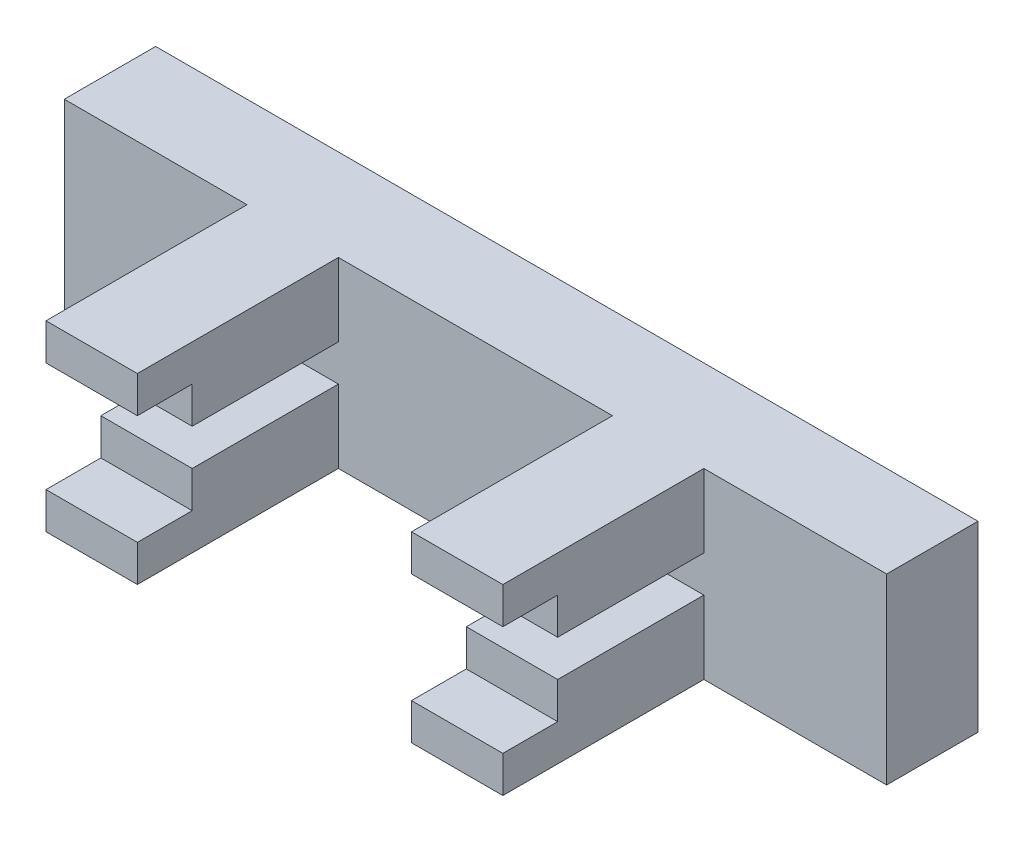
ISO-10303-21;
HEADER;
FILE_DESCRIPTION(('STEP AP214'),'2;1');
FILE_NAME('part.step','',(''),(''),'','','');
FILE_SCHEMA(('AUTOMOTIVE_DESIGN { 1 0 10303 214 1 1 1 1 }'));
ENDSEC;
DATA;
#1=APPLICATION_CONTEXT('core data for automotive mechanical design processes');
#2=APPLICATION_PROTOCOL_DEFINITION('international standard','automotive_design',2000,#1);
#3=PRODUCT_CONTEXT('',#1,'mechanical');
#4=PRODUCT('Part','Part','',(#3));
#5=PRODUCT_RELATED_PRODUCT_CATEGORY('part','',(#4));
#6=PRODUCT_DEFINITION_FORMATION('','',#4);
#7=PRODUCT_DEFINITION_CONTEXT('part definition',#1,'design');
#8=PRODUCT_DEFINITION('design','',#6,#7);
#9=PRODUCT_DEFINITION_SHAPE('','',#8);
#10=(LENGTH_UNIT() NAMED_UNIT(*) SI_UNIT(.MILLI.,.METRE.));
#11=(NAMED_UNIT(*) PLANE_ANGLE_UNIT() SI_UNIT($,.RADIAN.));
#12=(NAMED_UNIT(*) SI_UNIT($,.STERADIAN.) SOLID_ANGLE_UNIT());
#13=UNCERTAINTY_MEASURE_WITH_UNIT(LENGTH_MEASURE(1.E-05),#10,'distance_accuracy_value','');
#14=(GEOMETRIC_REPRESENTATION_CONTEXT(3) GLOBAL_UNCERTAINTY_ASSIGNED_CONTEXT((#13)) GLOBAL_UNIT_ASSIGNED_CONTEXT((#10,
#11,#12)) REPRESENTATION_CONTEXT('',''));
#15=CARTESIAN_POINT('',(0.,0.,0.));
#16=DIRECTION('',(0.,0.,1.));
#17=DIRECTION('',(1.,0.,0.));
#18=AXIS2_PLACEMENT_3D('',#15,#16,#17);
#19=CARTESIAN_POINT('',(7.5,-1.,16.));
#20=DIRECTION('',(0.,-1.,0.));
#21=DIRECTION('',(0.,0.,-1.));
#22=AXIS2_PLACEMENT_3D('',#19,#20,#21);
#23=PLANE('',#22);
#24=DIRECTION('',(-1.,0.,0.));
#25=VECTOR('',#24,1.);
#26=CARTESIAN_POINT('',(7.5,-1.,13.));
#27=LINE('',#26,#25);
#28=CARTESIAN_POINT('',(12.5,-1.,13.));
#29=VERTEX_POINT('',#28);
#30=CARTESIAN_POINT('',(7.5,-1.,13.));
#31=VERTEX_POINT('',#30);
#32=EDGE_CURVE('E234',#29,#31,#27,.T.);
#33=ORIENTED_EDGE('',*,*,#32,.F.);
#34=DIRECTION('',(0.,0.,-1.));
#35=VECTOR('',#34,1.);
#36=CARTESIAN_POINT('',(12.5,-1.,16.));
#37=LINE('',#36,#35);
#38=CARTESIAN_POINT('',(12.5,-1.,5.));
#39=VERTEX_POINT('',#38);
#40=EDGE_CURVE('E281',#29,#39,#37,.T.);
#41=ORIENTED_EDGE('',*,*,#40,.T.);
#42=DIRECTION('',(-1.,0.,0.));
#43=VECTOR('',#42,1.);
#44=CARTESIAN_POINT('',(7.5,-1.,5.));
#45=LINE('',#44,#43);
#46=CARTESIAN_POINT('',(7.5,-1.,5.));
#47=VERTEX_POINT('',#46);
#48=EDGE_CURVE('E267',#39,#47,#45,.T.);
#49=ORIENTED_EDGE('',*,*,#48,.T.);
#50=DIRECTION('',(0.,0.,-1.));
#51=VECTOR('',#50,1.);
#52=CARTESIAN_POINT('',(7.5,-1.,16.));
#53=LINE('',#52,#51);
#54=EDGE_CURVE('E272',#31,#47,#53,.T.);
#55=ORIENTED_EDGE('',*,*,#54,.F.);
#56=EDGE_LOOP('',(#33,#41,#49,#55));
#57=FACE_BOUND('',#56,.T.);
#58=ADVANCED_FACE('F35',(#57),#23,.F.);
#59=CARTESIAN_POINT('',(-12.5,-1.,16.));
#60=DIRECTION('',(0.,-1.,0.));
#61=DIRECTION('',(0.,0.,-1.));
#62=AXIS2_PLACEMENT_3D('',#59,#60,#61);
#63=PLANE('',#62);
#64=DIRECTION('',(-1.,0.,0.));
#65=VECTOR('',#64,1.);
#66=CARTESIAN_POINT('',(-12.5,-1.,13.));
#67=LINE('',#66,#65);
#68=CARTESIAN_POINT('',(-7.5,-1.,13.));
#69=VERTEX_POINT('',#68);
#70=CARTESIAN_POINT('',(-12.5,-1.,13.));
#71=VERTEX_POINT('',#70);
#72=EDGE_CURVE('E257',#69,#71,#67,.T.);
#73=ORIENTED_EDGE('',*,*,#72,.F.);
#74=DIRECTION('',(0.,0.,-1.));
#75=VECTOR('',#74,1.);
#76=CARTESIAN_POINT('',(-7.5,-1.,16.));
#77=LINE('',#76,#75);
#78=CARTESIAN_POINT('',(-7.5,-1.,5.));
#79=VERTEX_POINT('',#78);
#80=EDGE_CURVE('E307',#69,#79,#77,.T.);
#81=ORIENTED_EDGE('',*,*,#80,.T.);
#82=DIRECTION('',(-1.,0.,0.));
#83=VECTOR('',#82,1.);
#84=CARTESIAN_POINT('',(-12.5,-1.,5.));
#85=LINE('',#84,#83);
#86=CARTESIAN_POINT('',(-12.5,-1.,5.));
#87=VERTEX_POINT('',#86);
#88=EDGE_CURVE('E293',#79,#87,#85,.T.);
#89=ORIENTED_EDGE('',*,*,#88,.T.);
#90=DIRECTION('',(0.,0.,-1.));
#91=VECTOR('',#90,1.);
#92=CARTESIAN_POINT('',(-12.5,-1.,16.));
#93=LINE('',#92,#91);
#94=EDGE_CURVE('E298',#71,#87,#93,.T.);
#95=ORIENTED_EDGE('',*,*,#94,.F.);
#96=EDGE_LOOP('',(#73,#81,#89,#95));
#97=FACE_BOUND('',#96,.T.);
#98=ADVANCED_FACE('F493',(#97),#63,.F.);
#99=CARTESIAN_POINT('',(0.,0.,5.));
#100=DIRECTION('',(0.,0.,1.));
#101=DIRECTION('',(1.,0.,0.));
#102=AXIS2_PLACEMENT_3D('',#99,#100,#101);
#103=PLANE('',#102);
#104=DIRECTION('',(1.,0.,0.));
#105=VECTOR('',#104,1.);
#106=CARTESIAN_POINT('',(-22.5,-5.,5.));
#107=LINE('',#106,#105);
#108=CARTESIAN_POINT('',(-7.5,-5.,5.));
#109=VERTEX_POINT('',#108);
#110=CARTESIAN_POINT('',(7.5,-5.,5.));
#111=VERTEX_POINT('',#110);
#112=EDGE_CURVE('E427',#109,#111,#107,.T.);
#113=ORIENTED_EDGE('',*,*,#112,.T.);
#114=DIRECTION('',(0.,-1.,0.));
#115=VECTOR('',#114,1.);
#116=CARTESIAN_POINT('',(7.5,-5.,5.));
#117=LINE('',#116,#115);
#118=EDGE_CURVE('E263',#47,#111,#117,.T.);
#119=ORIENTED_EDGE('',*,*,#118,.F.);
#120=ORIENTED_EDGE('',*,*,#48,.F.);
#121=DIRECTION('',(0.,1.,0.));
#122=VECTOR('',#121,1.);
#123=CARTESIAN_POINT('',(12.5,-5.,5.));
#124=LINE('',#123,#122);
#125=CARTESIAN_POINT('',(12.5,-5.,5.));
#126=VERTEX_POINT('',#125);
#127=EDGE_CURVE('E275',#126,#39,#124,.T.);
#128=ORIENTED_EDGE('',*,*,#127,.F.);
#129=CARTESIAN_POINT('',(22.5,-5.,5.));
#130=VERTEX_POINT('',#129);
#131=EDGE_CURVE('E423',#126,#130,#107,.T.);
#132=ORIENTED_EDGE('',*,*,#131,.T.);
#133=DIRECTION('',(0.,1.,0.));
#134=VECTOR('',#133,1.);
#135=CARTESIAN_POINT('',(22.5,5.,5.));
#136=LINE('',#135,#134);
#137=CARTESIAN_POINT('',(22.5,5.,5.));
#138=VERTEX_POINT('',#137);
#139=EDGE_CURVE('E414',#130,#138,#136,.T.);
#140=ORIENTED_EDGE('',*,*,#139,.T.);
#141=DIRECTION('',(-1.,0.,0.));
#142=VECTOR('',#141,1.);
#143=CARTESIAN_POINT('',(-22.5,5.,5.));
#144=LINE('',#143,#142);
#145=CARTESIAN_POINT('',(12.5,5.,5.));
#146=VERTEX_POINT('',#145);
#147=EDGE_CURVE('E415',#138,#146,#144,.T.);
#148=ORIENTED_EDGE('',*,*,#147,.T.);
#149=DIRECTION('',(0.,1.,0.));
#150=VECTOR('',#149,1.);
#151=CARTESIAN_POINT('',(12.5,5.,5.));
#152=LINE('',#151,#150);
#153=CARTESIAN_POINT('',(12.5,0.999999999999999,5.));
#154=VERTEX_POINT('',#153);
#155=EDGE_CURVE('E352',#154,#146,#152,.T.);
#156=ORIENTED_EDGE('',*,*,#155,.F.);
#157=DIRECTION('',(1.,0.,0.));
#158=VECTOR('',#157,1.);
#159=CARTESIAN_POINT('',(7.5,0.999999999999999,5.));
#160=LINE('',#159,#158);
#161=CARTESIAN_POINT('',(7.5,0.999999999999999,5.));
#162=VERTEX_POINT('',#161);
#163=EDGE_CURVE('E359',#162,#154,#160,.T.);
#164=ORIENTED_EDGE('',*,*,#163,.F.);
#165=DIRECTION('',(0.,-1.,0.));
#166=VECTOR('',#165,1.);
#167=CARTESIAN_POINT('',(7.5,5.,5.));
#168=LINE('',#167,#166);
#169=CARTESIAN_POINT('',(7.5,5.,5.));
#170=VERTEX_POINT('',#169);
#171=EDGE_CURVE('E346',#170,#162,#168,.T.);
#172=ORIENTED_EDGE('',*,*,#171,.F.);
#173=CARTESIAN_POINT('',(-7.5,5.,5.));
#174=VERTEX_POINT('',#173);
#175=EDGE_CURVE('E39',#170,#174,#144,.T.);
#176=ORIENTED_EDGE('',*,*,#175,.T.);
#177=DIRECTION('',(0.,1.,0.));
#178=VECTOR('',#177,1.);
#179=CARTESIAN_POINT('',(-7.49999999999999,5.,5.));
#180=LINE('',#179,#178);
#181=CARTESIAN_POINT('',(-7.49999999999999,0.999999999999999,5.));
#182=VERTEX_POINT('',#181);
#183=EDGE_CURVE('E378',#182,#174,#180,.T.);
#184=ORIENTED_EDGE('',*,*,#183,.F.);
#185=DIRECTION('',(1.,0.,0.));
#186=VECTOR('',#185,1.);
#187=CARTESIAN_POINT('',(-12.5,0.999999999999999,5.));
#188=LINE('',#187,#186);
#189=CARTESIAN_POINT('',(-12.5,0.999999999999999,5.));
#190=VERTEX_POINT('',#189);
#191=EDGE_CURVE('E383',#190,#182,#188,.T.);
#192=ORIENTED_EDGE('',*,*,#191,.F.);
#193=DIRECTION('',(0.,-1.,0.));
#194=VECTOR('',#193,1.);
#195=CARTESIAN_POINT('',(-12.5,5.,5.));
#196=LINE('',#195,#194);
#197=CARTESIAN_POINT('',(-12.5,5.,5.));
#198=VERTEX_POINT('',#197);
#199=EDGE_CURVE('E373',#198,#190,#196,.T.);
#200=ORIENTED_EDGE('',*,*,#199,.F.);
#201=CARTESIAN_POINT('',(-22.5,5.,5.));
#202=VERTEX_POINT('',#201);
#203=EDGE_CURVE('E412',#198,#202,#144,.T.);
#204=ORIENTED_EDGE('',*,*,#203,.T.);
#205=DIRECTION('',(0.,-1.,0.));
#206=VECTOR('',#205,1.);
#207=CARTESIAN_POINT('',(-22.5,5.,5.));
#208=LINE('',#207,#206);
#209=CARTESIAN_POINT('',(-22.5,-5.,5.));
#210=VERTEX_POINT('',#209);
#211=EDGE_CURVE('E419',#202,#210,#208,.T.);
#212=ORIENTED_EDGE('',*,*,#211,.T.);
#213=CARTESIAN_POINT('',(-12.5,-5.,5.));
#214=VERTEX_POINT('',#213);
#215=EDGE_CURVE('E424',#210,#214,#107,.T.);
#216=ORIENTED_EDGE('',*,*,#215,.T.);
#217=DIRECTION('',(0.,-1.,0.));
#218=VECTOR('',#217,1.);
#219=CARTESIAN_POINT('',(-12.5,-5.,5.));
#220=LINE('',#219,#218);
#221=EDGE_CURVE('E289',#87,#214,#220,.T.);
#222=ORIENTED_EDGE('',*,*,#221,.F.);
#223=ORIENTED_EDGE('',*,*,#88,.F.);
#224=DIRECTION('',(0.,1.,0.));
#225=VECTOR('',#224,1.);
#226=CARTESIAN_POINT('',(-7.5,-5.,5.));
#227=LINE('',#226,#225);
#228=EDGE_CURVE('E301',#109,#79,#227,.T.);
#229=ORIENTED_EDGE('',*,*,#228,.F.);
#230=EDGE_LOOP('',(#113,#119,#120,#128,#132,#140,#148,#156,#164,#172,#176,#184,#192,#200,#204,
#212,#216,#222,#223,#229));
#231=FACE_BOUND('',#230,.T.);
#232=ADVANCED_FACE('F463',(#231),#103,.T.);
#233=CARTESIAN_POINT('',(7.5,0.999999999999999,16.));
#234=DIRECTION('',(0.,1.,0.));
#235=DIRECTION('',(-1.,0.,0.));
#236=AXIS2_PLACEMENT_3D('',#233,#234,#235);
#237=PLANE('',#236);
#238=DIRECTION('',(1.,0.,0.));
#239=VECTOR('',#238,1.);
#240=CARTESIAN_POINT('',(7.5,0.999999999999999,13.));
#241=LINE('',#240,#239);
#242=CARTESIAN_POINT('',(7.5,0.999999999999999,13.));
#243=VERTEX_POINT('',#242);
#244=CARTESIAN_POINT('',(12.5,0.999999999999999,13.));
#245=VERTEX_POINT('',#244);
#246=EDGE_CURVE('E318',#243,#245,#241,.T.);
#247=ORIENTED_EDGE('',*,*,#246,.F.);
#248=DIRECTION('',(0.,0.,-1.));
#249=VECTOR('',#248,1.);
#250=CARTESIAN_POINT('',(7.5,0.999999999999999,16.));
#251=LINE('',#250,#249);
#252=EDGE_CURVE('E371',#243,#162,#251,.T.);
#253=ORIENTED_EDGE('',*,*,#252,.T.);
#254=ORIENTED_EDGE('',*,*,#163,.T.);
#255=DIRECTION('',(0.,0.,-1.));
#256=VECTOR('',#255,1.);
#257=CARTESIAN_POINT('',(12.5,0.999999999999999,16.));
#258=LINE('',#257,#256);
#259=EDGE_CURVE('E369',#245,#154,#258,.T.);
#260=ORIENTED_EDGE('',*,*,#259,.F.);
#261=EDGE_LOOP('',(#247,#253,#254,#260));
#262=FACE_BOUND('',#261,.T.);
#263=ADVANCED_FACE('F539',(#262),#237,.F.);
#264=CARTESIAN_POINT('',(-12.5,0.999999999999999,16.));
#265=DIRECTION('',(0.,1.,0.));
#266=DIRECTION('',(0.,0.,1.));
#267=AXIS2_PLACEMENT_3D('',#264,#265,#266);
#268=PLANE('',#267);
#269=DIRECTION('',(1.,0.,0.));
#270=VECTOR('',#269,1.);
#271=CARTESIAN_POINT('',(-12.5,0.999999999999999,13.));
#272=LINE('',#271,#270);
#273=CARTESIAN_POINT('',(-12.5,0.999999999999999,13.));
#274=VERTEX_POINT('',#273);
#275=CARTESIAN_POINT('',(-7.49999999999999,0.999999999999999,13.));
#276=VERTEX_POINT('',#275);
#277=EDGE_CURVE('E334',#274,#276,#272,.T.);
#278=ORIENTED_EDGE('',*,*,#277,.F.);
#279=DIRECTION('',(0.,0.,-1.));
#280=VECTOR('',#279,1.);
#281=CARTESIAN_POINT('',(-12.5,0.999999999999999,16.));
#282=LINE('',#281,#280);
#283=EDGE_CURVE('E402',#274,#190,#282,.T.);
#284=ORIENTED_EDGE('',*,*,#283,.T.);
#285=ORIENTED_EDGE('',*,*,#191,.T.);
#286=DIRECTION('',(0.,0.,-1.));
#287=VECTOR('',#286,1.);
#288=CARTESIAN_POINT('',(-7.49999999999999,0.999999999999999,16.));
#289=LINE('',#288,#287);
#290=EDGE_CURVE('E388',#276,#182,#289,.T.);
#291=ORIENTED_EDGE('',*,*,#290,.F.);
#292=EDGE_LOOP('',(#278,#284,#285,#291));
#293=FACE_BOUND('',#292,.T.);
#294=ADVANCED_FACE('F542',(#293),#268,.F.);
#295=CARTESIAN_POINT('',(22.5,5.,5.));
#296=DIRECTION('',(-1.,0.,0.));
#297=DIRECTION('',(0.,0.,1.));
#298=AXIS2_PLACEMENT_3D('',#295,#296,#297);
#299=PLANE('',#298);
#300=DIRECTION('',(0.,1.,0.));
#301=VECTOR('',#300,1.);
#302=CARTESIAN_POINT('',(22.5,5.,0.));
#303=LINE('',#302,#301);
#304=CARTESIAN_POINT('',(22.5,-5.,0.));
#305=VERTEX_POINT('',#304);
#306=CARTESIAN_POINT('',(22.5,5.,0.));
#307=VERTEX_POINT('',#306);
#308=EDGE_CURVE('E428',#305,#307,#303,.T.);
#309=ORIENTED_EDGE('',*,*,#308,.T.);
#310=DIRECTION('',(0.,0.,-1.));
#311=VECTOR('',#310,1.);
#312=CARTESIAN_POINT('',(22.5,5.,5.));
#313=LINE('',#312,#311);
#314=EDGE_CURVE('E11',#138,#307,#313,.T.);
#315=ORIENTED_EDGE('',*,*,#314,.F.);
#316=ORIENTED_EDGE('',*,*,#139,.F.);
#317=DIRECTION('',(0.,0.,-1.));
#318=VECTOR('',#317,1.);
#319=CARTESIAN_POINT('',(22.5,-5.,5.));
#320=LINE('',#319,#318);
#321=EDGE_CURVE('E426',#130,#305,#320,.T.);
#322=ORIENTED_EDGE('',*,*,#321,.T.);
#323=EDGE_LOOP('',(#309,#315,#316,#322));
#324=FACE_BOUND('',#323,.T.);
#325=ADVANCED_FACE('F37',(#324),#299,.F.);
#326=CARTESIAN_POINT('',(-22.5,5.,5.));
#327=DIRECTION('',(0.,-1.,0.));
#328=DIRECTION('',(0.,0.,-1.));
#329=AXIS2_PLACEMENT_3D('',#326,#327,#328);
#330=PLANE('',#329);
#331=DIRECTION('',(-1.,0.,0.));
#332=VECTOR('',#331,1.);
#333=CARTESIAN_POINT('',(-22.5,5.,0.));
#334=LINE('',#333,#332);
#335=CARTESIAN_POINT('',(-22.5,5.,0.));
#336=VERTEX_POINT('',#335);
#337=EDGE_CURVE('E431',#307,#336,#334,.T.);
#338=ORIENTED_EDGE('',*,*,#337,.T.);
#339=DIRECTION('',(0.,0.,-1.));
#340=VECTOR('',#339,1.);
#341=CARTESIAN_POINT('',(-22.5,5.,5.));
#342=LINE('',#341,#340);
#343=EDGE_CURVE('E45',#202,#336,#342,.T.);
#344=ORIENTED_EDGE('',*,*,#343,.F.);
#345=ORIENTED_EDGE('',*,*,#203,.F.);
#346=DIRECTION('',(0.,0.,-1.));
#347=VECTOR('',#346,1.);
#348=CARTESIAN_POINT('',(-12.5,5.,16.));
#349=LINE('',#348,#347);
#350=CARTESIAN_POINT('',(-12.5,5.,16.));
#351=VERTEX_POINT('',#350);
#352=EDGE_CURVE('E382',#351,#198,#349,.T.);
#353=ORIENTED_EDGE('',*,*,#352,.F.);
#354=DIRECTION('',(-1.,0.,0.));
#355=VECTOR('',#354,1.);
#356=CARTESIAN_POINT('',(-12.5,5.,16.));
#357=LINE('',#356,#355);
#358=CARTESIAN_POINT('',(-7.49999999999999,5.,16.));
#359=VERTEX_POINT('',#358);
#360=EDGE_CURVE('E380',#359,#351,#357,.T.);
#361=ORIENTED_EDGE('',*,*,#360,.F.);
#362=DIRECTION('',(0.,0.,-1.));
#363=VECTOR('',#362,1.);
#364=CARTESIAN_POINT('',(-7.49999999999999,5.,16.));
#365=LINE('',#364,#363);
#366=EDGE_CURVE('E396',#359,#174,#365,.T.);
#367=ORIENTED_EDGE('',*,*,#366,.T.);
#368=ORIENTED_EDGE('',*,*,#175,.F.);
#369=DIRECTION('',(0.,0.,-1.));
#370=VECTOR('',#369,1.);
#371=CARTESIAN_POINT('',(7.5,5.,16.));
#372=LINE('',#371,#370);
#373=CARTESIAN_POINT('',(7.5,5.,16.));
#374=VERTEX_POINT('',#373);
#375=EDGE_CURVE('E356',#374,#170,#372,.T.);
#376=ORIENTED_EDGE('',*,*,#375,.F.);
#377=DIRECTION('',(-1.,0.,0.));
#378=VECTOR('',#377,1.);
#379=CARTESIAN_POINT('',(7.5,5.,16.));
#380=LINE('',#379,#378);
#381=CARTESIAN_POINT('',(12.5,5.,16.));
#382=VERTEX_POINT('',#381);
#383=EDGE_CURVE('E354',#382,#374,#380,.T.);
#384=ORIENTED_EDGE('',*,*,#383,.F.);
#385=DIRECTION('',(0.,0.,-1.));
#386=VECTOR('',#385,1.);
#387=CARTESIAN_POINT('',(12.5,5.,16.));
#388=LINE('',#387,#386);
#389=EDGE_CURVE('E366',#382,#146,#388,.T.);
#390=ORIENTED_EDGE('',*,*,#389,.T.);
#391=ORIENTED_EDGE('',*,*,#147,.F.);
#392=ORIENTED_EDGE('',*,*,#314,.T.);
#393=EDGE_LOOP('',(#338,#344,#345,#353,#361,#367,#368,#376,#384,#390,#391,#392));
#394=FACE_BOUND('',#393,.T.);
#395=ADVANCED_FACE('F568',(#394),#330,.F.);
#396=CARTESIAN_POINT('',(-22.5,5.,5.));
#397=DIRECTION('',(1.,0.,0.));
#398=DIRECTION('',(0.,0.,-1.));
#399=AXIS2_PLACEMENT_3D('',#396,#397,#398);
#400=PLANE('',#399);
#401=DIRECTION('',(0.,-1.,0.));
#402=VECTOR('',#401,1.);
#403=CARTESIAN_POINT('',(-22.5,5.,0.));
#404=LINE('',#403,#402);
#405=CARTESIAN_POINT('',(-22.5,-5.,0.));
#406=VERTEX_POINT('',#405);
#407=EDGE_CURVE('E433',#336,#406,#404,.T.);
#408=ORIENTED_EDGE('',*,*,#407,.T.);
#409=DIRECTION('',(0.,0.,-1.));
#410=VECTOR('',#409,1.);
#411=CARTESIAN_POINT('',(-22.5,-5.,5.));
#412=LINE('',#411,#410);
#413=EDGE_CURVE('E439',#210,#406,#412,.T.);
#414=ORIENTED_EDGE('',*,*,#413,.F.);
#415=ORIENTED_EDGE('',*,*,#211,.F.);
#416=ORIENTED_EDGE('',*,*,#343,.T.);
#417=EDGE_LOOP('',(#408,#414,#415,#416));
#418=FACE_BOUND('',#417,.T.);
#419=ADVANCED_FACE('F447',(#418),#400,.F.);
#420=CARTESIAN_POINT('',(-22.5,-5.,5.));
#421=DIRECTION('',(0.,1.,0.));
#422=DIRECTION('',(0.,0.,1.));
#423=AXIS2_PLACEMENT_3D('',#420,#421,#422);
#424=PLANE('',#423);
#425=DIRECTION('',(1.,0.,0.));
#426=VECTOR('',#425,1.);
#427=CARTESIAN_POINT('',(-22.5,-5.,0.));
#428=LINE('',#427,#426);
#429=EDGE_CURVE('E435',#406,#305,#428,.T.);
#430=ORIENTED_EDGE('',*,*,#429,.T.);
#431=ORIENTED_EDGE('',*,*,#321,.F.);
#432=ORIENTED_EDGE('',*,*,#131,.F.);
#433=DIRECTION('',(0.,0.,-1.));
#434=VECTOR('',#433,1.);
#435=CARTESIAN_POINT('',(12.5,-5.,16.));
#436=LINE('',#435,#434);
#437=CARTESIAN_POINT('',(12.5,-5.,16.));
#438=VERTEX_POINT('',#437);
#439=EDGE_CURVE('E283',#438,#126,#436,.T.);
#440=ORIENTED_EDGE('',*,*,#439,.F.);
#441=DIRECTION('',(1.,0.,0.));
#442=VECTOR('',#441,1.);
#443=CARTESIAN_POINT('',(7.5,-5.,16.));
#444=LINE('',#443,#442);
#445=CARTESIAN_POINT('',(7.5,-5.,16.));
#446=VERTEX_POINT('',#445);
#447=EDGE_CURVE('E266',#446,#438,#444,.T.);
#448=ORIENTED_EDGE('',*,*,#447,.F.);
#449=DIRECTION('',(0.,0.,-1.));
#450=VECTOR('',#449,1.);
#451=CARTESIAN_POINT('',(7.5,-5.,16.));
#452=LINE('',#451,#450);
#453=EDGE_CURVE('E286',#446,#111,#452,.T.);
#454=ORIENTED_EDGE('',*,*,#453,.T.);
#455=ORIENTED_EDGE('',*,*,#112,.F.);
#456=DIRECTION('',(0.,0.,-1.));
#457=VECTOR('',#456,1.);
#458=CARTESIAN_POINT('',(-7.5,-5.,16.));
#459=LINE('',#458,#457);
#460=CARTESIAN_POINT('',(-7.5,-5.,16.));
#461=VERTEX_POINT('',#460);
#462=EDGE_CURVE('E309',#461,#109,#459,.T.);
#463=ORIENTED_EDGE('',*,*,#462,.F.);
#464=DIRECTION('',(1.,0.,0.));
#465=VECTOR('',#464,1.);
#466=CARTESIAN_POINT('',(-12.5,-5.,16.));
#467=LINE('',#466,#465);
#468=CARTESIAN_POINT('',(-12.5,-5.,16.));
#469=VERTEX_POINT('',#468);
#470=EDGE_CURVE('E292',#469,#461,#467,.T.);
#471=ORIENTED_EDGE('',*,*,#470,.F.);
#472=DIRECTION('',(0.,0.,-1.));
#473=VECTOR('',#472,1.);
#474=CARTESIAN_POINT('',(-12.5,-5.,16.));
#475=LINE('',#474,#473);
#476=EDGE_CURVE('E312',#469,#214,#475,.T.);
#477=ORIENTED_EDGE('',*,*,#476,.T.);
#478=ORIENTED_EDGE('',*,*,#215,.F.);
#479=ORIENTED_EDGE('',*,*,#413,.T.);
#480=EDGE_LOOP('',(#430,#431,#432,#440,#448,#454,#455,#463,#471,#477,#478,#479));
#481=FACE_BOUND('',#480,.T.);
#482=ADVANCED_FACE('F456',(#481),#424,.F.);
#483=CARTESIAN_POINT('',(0.,0.,0.));
#484=DIRECTION('',(0.,0.,1.));
#485=DIRECTION('',(1.,0.,0.));
#486=AXIS2_PLACEMENT_3D('',#483,#484,#485);
#487=PLANE('',#486);
#488=ORIENTED_EDGE('',*,*,#308,.F.);
#489=ORIENTED_EDGE('',*,*,#429,.F.);
#490=ORIENTED_EDGE('',*,*,#407,.F.);
#491=ORIENTED_EDGE('',*,*,#337,.F.);
#492=EDGE_LOOP('',(#488,#489,#490,#491));
#493=FACE_BOUND('',#492,.T.);
#494=ADVANCED_FACE('F453',(#493),#487,.F.);
#495=CARTESIAN_POINT('',(-12.5,5.,16.));
#496=DIRECTION('',(1.,0.,0.));
#497=DIRECTION('',(0.,0.,-1.));
#498=AXIS2_PLACEMENT_3D('',#495,#496,#497);
#499=PLANE('',#498);
#500=DIRECTION('',(0.,-1.,0.));
#501=VECTOR('',#500,1.);
#502=CARTESIAN_POINT('',(-12.5,3.,13.));
#503=LINE('',#502,#501);
#504=CARTESIAN_POINT('',(-12.5,3.,13.));
#505=VERTEX_POINT('',#504);
#506=EDGE_CURVE('E332',#505,#274,#503,.T.);
#507=ORIENTED_EDGE('',*,*,#506,.F.);
#508=DIRECTION('',(0.,0.,1.));
#509=VECTOR('',#508,1.);
#510=CARTESIAN_POINT('',(-12.5,3.,13.));
#511=LINE('',#510,#509);
#512=CARTESIAN_POINT('',(-12.5,3.,16.));
#513=VERTEX_POINT('',#512);
#514=EDGE_CURVE('E343',#505,#513,#511,.T.);
#515=ORIENTED_EDGE('',*,*,#514,.T.);
#516=DIRECTION('',(0.,-1.,0.));
#517=VECTOR('',#516,1.);
#518=CARTESIAN_POINT('',(-12.5,5.,16.));
#519=LINE('',#518,#517);
#520=EDGE_CURVE('E374',#351,#513,#519,.T.);
#521=ORIENTED_EDGE('',*,*,#520,.F.);
#522=ORIENTED_EDGE('',*,*,#352,.T.);
#523=ORIENTED_EDGE('',*,*,#199,.T.);
#524=ORIENTED_EDGE('',*,*,#283,.F.);
#525=EDGE_LOOP('',(#507,#515,#521,#522,#523,#524));
#526=FACE_BOUND('',#525,.T.);
#527=ADVANCED_FACE('F554',(#526),#499,.F.);
#528=CARTESIAN_POINT('',(-7.49999999999999,5.,16.));
#529=DIRECTION('',(-1.,0.,0.));
#530=DIRECTION('',(0.,-1.,0.));
#531=AXIS2_PLACEMENT_3D('',#528,#529,#530);
#532=PLANE('',#531);
#533=DIRECTION('',(0.,1.,0.));
#534=VECTOR('',#533,1.);
#535=CARTESIAN_POINT('',(-7.49999999999999,5.,16.));
#536=LINE('',#535,#534);
#537=CARTESIAN_POINT('',(-7.49999999999999,3.,16.));
#538=VERTEX_POINT('',#537);
#539=EDGE_CURVE('E377',#538,#359,#536,.T.);
#540=ORIENTED_EDGE('',*,*,#539,.F.);
#541=DIRECTION('',(0.,0.,1.));
#542=VECTOR('',#541,1.);
#543=CARTESIAN_POINT('',(-7.49999999999999,3.,13.));
#544=LINE('',#543,#542);
#545=CARTESIAN_POINT('',(-7.49999999999999,3.,13.));
#546=VERTEX_POINT('',#545);
#547=EDGE_CURVE('E341',#546,#538,#544,.T.);
#548=ORIENTED_EDGE('',*,*,#547,.F.);
#549=DIRECTION('',(0.,1.,0.));
#550=VECTOR('',#549,1.);
#551=CARTESIAN_POINT('',(-7.49999999999999,3.,13.));
#552=LINE('',#551,#550);
#553=EDGE_CURVE('E336',#276,#546,#552,.T.);
#554=ORIENTED_EDGE('',*,*,#553,.F.);
#555=ORIENTED_EDGE('',*,*,#290,.T.);
#556=ORIENTED_EDGE('',*,*,#183,.T.);
#557=ORIENTED_EDGE('',*,*,#366,.F.);
#558=EDGE_LOOP('',(#540,#548,#554,#555,#556,#557));
#559=FACE_BOUND('',#558,.T.);
#560=ADVANCED_FACE('F550',(#559),#532,.F.);
#561=CARTESIAN_POINT('',(0.,0.,16.));
#562=DIRECTION('',(0.,0.,1.));
#563=DIRECTION('',(1.,0.,0.));
#564=AXIS2_PLACEMENT_3D('',#561,#562,#563);
#565=PLANE('',#564);
#566=DIRECTION('',(-1.,0.,0.));
#567=VECTOR('',#566,1.);
#568=CARTESIAN_POINT('',(-12.5,3.,16.));
#569=LINE('',#568,#567);
#570=EDGE_CURVE('E330',#538,#513,#569,.T.);
#571=ORIENTED_EDGE('',*,*,#570,.F.);
#572=ORIENTED_EDGE('',*,*,#539,.T.);
#573=ORIENTED_EDGE('',*,*,#360,.T.);
#574=ORIENTED_EDGE('',*,*,#520,.T.);
#575=EDGE_LOOP('',(#571,#572,#573,#574));
#576=FACE_BOUND('',#575,.T.);
#577=ADVANCED_FACE('F546',(#576),#565,.T.);
#578=CARTESIAN_POINT('',(7.5,5.,16.));
#579=DIRECTION('',(1.,0.,0.));
#580=DIRECTION('',(0.,1.,0.));
#581=AXIS2_PLACEMENT_3D('',#578,#579,#580);
#582=PLANE('',#581);
#583=DIRECTION('',(0.,-1.,0.));
#584=VECTOR('',#583,1.);
#585=CARTESIAN_POINT('',(7.5,3.,13.));
#586=LINE('',#585,#584);
#587=CARTESIAN_POINT('',(7.5,3.,13.));
#588=VERTEX_POINT('',#587);
#589=EDGE_CURVE('E316',#588,#243,#586,.T.);
#590=ORIENTED_EDGE('',*,*,#589,.F.);
#591=DIRECTION('',(0.,0.,1.));
#592=VECTOR('',#591,1.);
#593=CARTESIAN_POINT('',(7.5,3.,13.));
#594=LINE('',#593,#592);
#595=CARTESIAN_POINT('',(7.5,3.,16.));
#596=VERTEX_POINT('',#595);
#597=EDGE_CURVE('E327',#588,#596,#594,.T.);
#598=ORIENTED_EDGE('',*,*,#597,.T.);
#599=DIRECTION('',(0.,-1.,0.));
#600=VECTOR('',#599,1.);
#601=CARTESIAN_POINT('',(7.5,5.,16.));
#602=LINE('',#601,#600);
#603=EDGE_CURVE('E348',#374,#596,#602,.T.);
#604=ORIENTED_EDGE('',*,*,#603,.F.);
#605=ORIENTED_EDGE('',*,*,#375,.T.);
#606=ORIENTED_EDGE('',*,*,#171,.T.);
#607=ORIENTED_EDGE('',*,*,#252,.F.);
#608=EDGE_LOOP('',(#590,#598,#604,#605,#606,#607));
#609=FACE_BOUND('',#608,.T.);
#610=ADVANCED_FACE('F537',(#609),#582,.F.);
#611=CARTESIAN_POINT('',(12.5,5.,16.));
#612=DIRECTION('',(-1.,0.,0.));
#613=DIRECTION('',(0.,0.,1.));
#614=AXIS2_PLACEMENT_3D('',#611,#612,#613);
#615=PLANE('',#614);
#616=DIRECTION('',(0.,1.,0.));
#617=VECTOR('',#616,1.);
#618=CARTESIAN_POINT('',(12.5,5.,16.));
#619=LINE('',#618,#617);
#620=CARTESIAN_POINT('',(12.5,3.,16.));
#621=VERTEX_POINT('',#620);
#622=EDGE_CURVE('E351',#621,#382,#619,.T.);
#623=ORIENTED_EDGE('',*,*,#622,.F.);
#624=DIRECTION('',(0.,0.,1.));
#625=VECTOR('',#624,1.);
#626=CARTESIAN_POINT('',(12.5,3.,13.));
#627=LINE('',#626,#625);
#628=CARTESIAN_POINT('',(12.5,3.,13.));
#629=VERTEX_POINT('',#628);
#630=EDGE_CURVE('E325',#629,#621,#627,.T.);
#631=ORIENTED_EDGE('',*,*,#630,.F.);
#632=DIRECTION('',(0.,1.,0.));
#633=VECTOR('',#632,1.);
#634=CARTESIAN_POINT('',(12.5,3.,13.));
#635=LINE('',#634,#633);
#636=EDGE_CURVE('E320',#245,#629,#635,.T.);
#637=ORIENTED_EDGE('',*,*,#636,.F.);
#638=ORIENTED_EDGE('',*,*,#259,.T.);
#639=ORIENTED_EDGE('',*,*,#155,.T.);
#640=ORIENTED_EDGE('',*,*,#389,.F.);
#641=EDGE_LOOP('',(#623,#631,#637,#638,#639,#640));
#642=FACE_BOUND('',#641,.T.);
#643=ADVANCED_FACE('F533',(#642),#615,.F.);
#644=CARTESIAN_POINT('',(0.,0.,16.));
#645=DIRECTION('',(0.,0.,1.));
#646=DIRECTION('',(1.,0.,0.));
#647=AXIS2_PLACEMENT_3D('',#644,#645,#646);
#648=PLANE('',#647);
#649=DIRECTION('',(-1.,0.,0.));
#650=VECTOR('',#649,1.);
#651=CARTESIAN_POINT('',(7.5,3.,16.));
#652=LINE('',#651,#650);
#653=EDGE_CURVE('E315',#621,#596,#652,.T.);
#654=ORIENTED_EDGE('',*,*,#653,.F.);
#655=ORIENTED_EDGE('',*,*,#622,.T.);
#656=ORIENTED_EDGE('',*,*,#383,.T.);
#657=ORIENTED_EDGE('',*,*,#603,.T.);
#658=EDGE_LOOP('',(#654,#655,#656,#657));
#659=FACE_BOUND('',#658,.T.);
#660=ADVANCED_FACE('F529',(#659),#648,.T.);
#661=CARTESIAN_POINT('',(-12.5,3.,13.));
#662=DIRECTION('',(0.,1.,0.));
#663=DIRECTION('',(0.,0.,1.));
#664=AXIS2_PLACEMENT_3D('',#661,#662,#663);
#665=PLANE('',#664);
#666=ORIENTED_EDGE('',*,*,#570,.T.);
#667=ORIENTED_EDGE('',*,*,#514,.F.);
#668=DIRECTION('',(-1.,0.,0.));
#669=VECTOR('',#668,1.);
#670=CARTESIAN_POINT('',(-12.5,3.,13.));
#671=LINE('',#670,#669);
#672=EDGE_CURVE('E338',#546,#505,#671,.T.);
#673=ORIENTED_EDGE('',*,*,#672,.F.);
#674=ORIENTED_EDGE('',*,*,#547,.T.);
#675=EDGE_LOOP('',(#666,#667,#673,#674));
#676=FACE_BOUND('',#675,.T.);
#677=ADVANCED_FACE('F525',(#676),#665,.F.);
#678=CARTESIAN_POINT('',(0.,0.,13.));
#679=DIRECTION('',(0.,0.,1.));
#680=DIRECTION('',(1.,0.,0.));
#681=AXIS2_PLACEMENT_3D('',#678,#679,#680);
#682=PLANE('',#681);
#683=ORIENTED_EDGE('',*,*,#506,.T.);
#684=ORIENTED_EDGE('',*,*,#277,.T.);
#685=ORIENTED_EDGE('',*,*,#553,.T.);
#686=ORIENTED_EDGE('',*,*,#672,.T.);
#687=EDGE_LOOP('',(#683,#684,#685,#686));
#688=FACE_BOUND('',#687,.T.);
#689=ADVANCED_FACE('F521',(#688),#682,.T.);
#690=CARTESIAN_POINT('',(7.5,3.,13.));
#691=DIRECTION('',(0.,1.,0.));
#692=DIRECTION('',(0.,0.,1.));
#693=AXIS2_PLACEMENT_3D('',#690,#691,#692);
#694=PLANE('',#693);
#695=ORIENTED_EDGE('',*,*,#653,.T.);
#696=ORIENTED_EDGE('',*,*,#597,.F.);
#697=DIRECTION('',(-1.,0.,0.));
#698=VECTOR('',#697,1.);
#699=CARTESIAN_POINT('',(7.5,3.,13.));
#700=LINE('',#699,#698);
#701=EDGE_CURVE('E322',#629,#588,#700,.T.);
#702=ORIENTED_EDGE('',*,*,#701,.F.);
#703=ORIENTED_EDGE('',*,*,#630,.T.);
#704=EDGE_LOOP('',(#695,#696,#702,#703));
#705=FACE_BOUND('',#704,.T.);
#706=ADVANCED_FACE('F517',(#705),#694,.F.);
#707=CARTESIAN_POINT('',(0.,0.,13.));
#708=DIRECTION('',(0.,0.,1.));
#709=DIRECTION('',(1.,0.,0.));
#710=AXIS2_PLACEMENT_3D('',#707,#708,#709);
#711=PLANE('',#710);
#712=ORIENTED_EDGE('',*,*,#589,.T.);
#713=ORIENTED_EDGE('',*,*,#246,.T.);
#714=ORIENTED_EDGE('',*,*,#636,.T.);
#715=ORIENTED_EDGE('',*,*,#701,.T.);
#716=EDGE_LOOP('',(#712,#713,#714,#715));
#717=FACE_BOUND('',#716,.T.);
#718=ADVANCED_FACE('F513',(#717),#711,.T.);
#719=CARTESIAN_POINT('',(-12.5,-5.,16.));
#720=DIRECTION('',(1.,0.,0.));
#721=DIRECTION('',(0.,0.,-1.));
#722=AXIS2_PLACEMENT_3D('',#719,#720,#721);
#723=PLANE('',#722);
#724=DIRECTION('',(0.,-1.,0.));
#725=VECTOR('',#724,1.);
#726=CARTESIAN_POINT('',(-12.5,-5.,16.));
#727=LINE('',#726,#725);
#728=CARTESIAN_POINT('',(-12.5,-3.,16.));
#729=VERTEX_POINT('',#728);
#730=EDGE_CURVE('E290',#729,#469,#727,.T.);
#731=ORIENTED_EDGE('',*,*,#730,.F.);
#732=DIRECTION('',(0.,0.,1.));
#733=VECTOR('',#732,1.);
#734=CARTESIAN_POINT('',(-12.5,-3.,13.));
#735=LINE('',#734,#733);
#736=CARTESIAN_POINT('',(-12.5,-3.,13.));
#737=VERTEX_POINT('',#736);
#738=EDGE_CURVE('E61',#737,#729,#735,.T.);
#739=ORIENTED_EDGE('',*,*,#738,.F.);
#740=DIRECTION('',(0.,-1.,0.));
#741=VECTOR('',#740,1.);
#742=CARTESIAN_POINT('',(-12.5,-1.,13.));
#743=LINE('',#742,#741);
#744=EDGE_CURVE('E249',#71,#737,#743,.T.);
#745=ORIENTED_EDGE('',*,*,#744,.F.);
#746=ORIENTED_EDGE('',*,*,#94,.T.);
#747=ORIENTED_EDGE('',*,*,#221,.T.);
#748=ORIENTED_EDGE('',*,*,#476,.F.);
#749=EDGE_LOOP('',(#731,#739,#745,#746,#747,#748));
#750=FACE_BOUND('',#749,.T.);
#751=ADVANCED_FACE('F509',(#750),#723,.F.);
#752=CARTESIAN_POINT('',(-7.5,-5.,16.));
#753=DIRECTION('',(-1.,0.,0.));
#754=DIRECTION('',(0.,-1.,0.));
#755=AXIS2_PLACEMENT_3D('',#752,#753,#754);
#756=PLANE('',#755);
#757=DIRECTION('',(0.,1.,0.));
#758=VECTOR('',#757,1.);
#759=CARTESIAN_POINT('',(-7.5,-1.,13.));
#760=LINE('',#759,#758);
#761=CARTESIAN_POINT('',(-7.5,-3.,13.));
#762=VERTEX_POINT('',#761);
#763=EDGE_CURVE('E255',#762,#69,#760,.T.);
#764=ORIENTED_EDGE('',*,*,#763,.F.);
#765=DIRECTION('',(0.,0.,1.));
#766=VECTOR('',#765,1.);
#767=CARTESIAN_POINT('',(-7.5,-3.,13.));
#768=LINE('',#767,#766);
#769=CARTESIAN_POINT('',(-7.5,-3.,16.));
#770=VERTEX_POINT('',#769);
#771=EDGE_CURVE('E260',#762,#770,#768,.T.);
#772=ORIENTED_EDGE('',*,*,#771,.T.);
#773=DIRECTION('',(0.,1.,0.));
#774=VECTOR('',#773,1.);
#775=CARTESIAN_POINT('',(-7.5,-5.,16.));
#776=LINE('',#775,#774);
#777=EDGE_CURVE('E295',#461,#770,#776,.T.);
#778=ORIENTED_EDGE('',*,*,#777,.F.);
#779=ORIENTED_EDGE('',*,*,#462,.T.);
#780=ORIENTED_EDGE('',*,*,#228,.T.);
#781=ORIENTED_EDGE('',*,*,#80,.F.);
#782=EDGE_LOOP('',(#764,#772,#778,#779,#780,#781));
#783=FACE_BOUND('',#782,.T.);
#784=ADVANCED_FACE('F504',(#783),#756,.F.);
#785=CARTESIAN_POINT('',(0.,0.,16.));
#786=DIRECTION('',(0.,0.,-1.));
#787=DIRECTION('',(-1.,0.,0.));
#788=AXIS2_PLACEMENT_3D('',#785,#786,#787);
#789=PLANE('',#788);
#790=ORIENTED_EDGE('',*,*,#777,.T.);
#791=DIRECTION('',(1.,0.,0.));
#792=VECTOR('',#791,1.);
#793=CARTESIAN_POINT('',(-12.5,-3.,16.));
#794=LINE('',#793,#792);
#795=EDGE_CURVE('E244',#729,#770,#794,.T.);
#796=ORIENTED_EDGE('',*,*,#795,.F.);
#797=ORIENTED_EDGE('',*,*,#730,.T.);
#798=ORIENTED_EDGE('',*,*,#470,.T.);
#799=EDGE_LOOP('',(#790,#796,#797,#798));
#800=FACE_BOUND('',#799,.T.);
#801=ADVANCED_FACE('F502',(#800),#789,.F.);
#802=CARTESIAN_POINT('',(7.5,-5.,16.));
#803=DIRECTION('',(1.,0.,0.));
#804=DIRECTION('',(0.,1.,0.));
#805=AXIS2_PLACEMENT_3D('',#802,#803,#804);
#806=PLANE('',#805);
#807=DIRECTION('',(0.,-1.,0.));
#808=VECTOR('',#807,1.);
#809=CARTESIAN_POINT('',(7.5,-5.,16.));
#810=LINE('',#809,#808);
#811=CARTESIAN_POINT('',(7.5,-3.,16.));
#812=VERTEX_POINT('',#811);
#813=EDGE_CURVE('E242',#812,#446,#810,.T.);
#814=ORIENTED_EDGE('',*,*,#813,.F.);
#815=DIRECTION('',(0.,0.,1.));
#816=VECTOR('',#815,1.);
#817=CARTESIAN_POINT('',(7.5,-3.,13.));
#818=LINE('',#817,#816);
#819=CARTESIAN_POINT('',(7.5,-3.,13.));
#820=VERTEX_POINT('',#819);
#821=EDGE_CURVE('E53',#820,#812,#818,.T.);
#822=ORIENTED_EDGE('',*,*,#821,.F.);
#823=DIRECTION('',(0.,-1.,0.));
#824=VECTOR('',#823,1.);
#825=CARTESIAN_POINT('',(7.5,-1.,13.));
#826=LINE('',#825,#824);
#827=EDGE_CURVE('E229',#31,#820,#826,.T.);
#828=ORIENTED_EDGE('',*,*,#827,.F.);
#829=ORIENTED_EDGE('',*,*,#54,.T.);
#830=ORIENTED_EDGE('',*,*,#118,.T.);
#831=ORIENTED_EDGE('',*,*,#453,.F.);
#832=EDGE_LOOP('',(#814,#822,#828,#829,#830,#831));
#833=FACE_BOUND('',#832,.T.);
#834=ADVANCED_FACE('F240',(#833),#806,.F.);
#835=CARTESIAN_POINT('',(12.5,-5.,16.));
#836=DIRECTION('',(-1.,0.,0.));
#837=DIRECTION('',(0.,-1.,0.));
#838=AXIS2_PLACEMENT_3D('',#835,#836,#837);
#839=PLANE('',#838);
#840=DIRECTION('',(0.,1.,0.));
#841=VECTOR('',#840,1.);
#842=CARTESIAN_POINT('',(12.5,-1.,13.));
#843=LINE('',#842,#841);
#844=CARTESIAN_POINT('',(12.5,-3.,13.));
#845=VERTEX_POINT('',#844);
#846=EDGE_CURVE('E228',#845,#29,#843,.T.);
#847=ORIENTED_EDGE('',*,*,#846,.F.);
#848=DIRECTION('',(0.,0.,1.));
#849=VECTOR('',#848,1.);
#850=CARTESIAN_POINT('',(12.5,-3.,13.));
#851=LINE('',#850,#849);
#852=CARTESIAN_POINT('',(12.5,-3.,16.));
#853=VERTEX_POINT('',#852);
#854=EDGE_CURVE('E225',#845,#853,#851,.T.);
#855=ORIENTED_EDGE('',*,*,#854,.T.);
#856=DIRECTION('',(0.,1.,0.));
#857=VECTOR('',#856,1.);
#858=CARTESIAN_POINT('',(12.5,-5.,16.));
#859=LINE('',#858,#857);
#860=EDGE_CURVE('E269',#438,#853,#859,.T.);
#861=ORIENTED_EDGE('',*,*,#860,.F.);
#862=ORIENTED_EDGE('',*,*,#439,.T.);
#863=ORIENTED_EDGE('',*,*,#127,.T.);
#864=ORIENTED_EDGE('',*,*,#40,.F.);
#865=EDGE_LOOP('',(#847,#855,#861,#862,#863,#864));
#866=FACE_BOUND('',#865,.T.);
#867=ADVANCED_FACE('F476',(#866),#839,.F.);
#868=CARTESIAN_POINT('',(0.,0.,16.));
#869=DIRECTION('',(0.,0.,-1.));
#870=DIRECTION('',(-1.,0.,0.));
#871=AXIS2_PLACEMENT_3D('',#868,#869,#870);
#872=PLANE('',#871);
#873=ORIENTED_EDGE('',*,*,#860,.T.);
#874=DIRECTION('',(1.,0.,0.));
#875=VECTOR('',#874,1.);
#876=CARTESIAN_POINT('',(7.5,-3.,16.));
#877=LINE('',#876,#875);
#878=EDGE_CURVE('E237',#812,#853,#877,.T.);
#879=ORIENTED_EDGE('',*,*,#878,.F.);
#880=ORIENTED_EDGE('',*,*,#813,.T.);
#881=ORIENTED_EDGE('',*,*,#447,.T.);
#882=EDGE_LOOP('',(#873,#879,#880,#881));
#883=FACE_BOUND('',#882,.T.);
#884=ADVANCED_FACE('F479',(#883),#872,.F.);
#885=CARTESIAN_POINT('',(-12.5,-3.,13.));
#886=DIRECTION('',(0.,-1.,0.));
#887=DIRECTION('',(0.,0.,-1.));
#888=AXIS2_PLACEMENT_3D('',#885,#886,#887);
#889=PLANE('',#888);
#890=ORIENTED_EDGE('',*,*,#795,.T.);
#891=ORIENTED_EDGE('',*,*,#771,.F.);
#892=DIRECTION('',(1.,0.,0.));
#893=VECTOR('',#892,1.);
#894=CARTESIAN_POINT('',(-12.5,-3.,13.));
#895=LINE('',#894,#893);
#896=EDGE_CURVE('E252',#737,#762,#895,.T.);
#897=ORIENTED_EDGE('',*,*,#896,.F.);
#898=ORIENTED_EDGE('',*,*,#738,.T.);
#899=EDGE_LOOP('',(#890,#891,#897,#898));
#900=FACE_BOUND('',#899,.T.);
#901=ADVANCED_FACE('F482',(#900),#889,.F.);
#902=CARTESIAN_POINT('',(0.,0.,13.));
#903=DIRECTION('',(0.,0.,1.));
#904=DIRECTION('',(1.,0.,0.));
#905=AXIS2_PLACEMENT_3D('',#902,#903,#904);
#906=PLANE('',#905);
#907=ORIENTED_EDGE('',*,*,#744,.T.);
#908=ORIENTED_EDGE('',*,*,#896,.T.);
#909=ORIENTED_EDGE('',*,*,#763,.T.);
#910=ORIENTED_EDGE('',*,*,#72,.T.);
#911=EDGE_LOOP('',(#907,#908,#909,#910));
#912=FACE_BOUND('',#911,.T.);
#913=ADVANCED_FACE('F488',(#912),#906,.T.);
#914=CARTESIAN_POINT('',(7.5,-3.,13.));
#915=DIRECTION('',(0.,-1.,0.));
#916=DIRECTION('',(0.,0.,-1.));
#917=AXIS2_PLACEMENT_3D('',#914,#915,#916);
#918=PLANE('',#917);
#919=ORIENTED_EDGE('',*,*,#878,.T.);
#920=ORIENTED_EDGE('',*,*,#854,.F.);
#921=DIRECTION('',(1.,0.,0.));
#922=VECTOR('',#921,1.);
#923=CARTESIAN_POINT('',(7.5,-3.,13.));
#924=LINE('',#923,#922);
#925=EDGE_CURVE('E221',#820,#845,#924,.T.);
#926=ORIENTED_EDGE('',*,*,#925,.F.);
#927=ORIENTED_EDGE('',*,*,#821,.T.);
#928=EDGE_LOOP('',(#919,#920,#926,#927));
#929=FACE_BOUND('',#928,.T.);
#930=ADVANCED_FACE('F223',(#929),#918,.F.);
#931=CARTESIAN_POINT('',(0.,0.,13.));
#932=DIRECTION('',(0.,0.,1.));
#933=DIRECTION('',(1.,0.,0.));
#934=AXIS2_PLACEMENT_3D('',#931,#932,#933);
#935=PLANE('',#934);
#936=ORIENTED_EDGE('',*,*,#827,.T.);
#937=ORIENTED_EDGE('',*,*,#925,.T.);
#938=ORIENTED_EDGE('',*,*,#846,.T.);
#939=ORIENTED_EDGE('',*,*,#32,.T.);
#940=EDGE_LOOP('',(#936,#937,#938,#939));
#941=FACE_BOUND('',#940,.T.);
#942=ADVANCED_FACE('F232',(#941),#935,.T.);
#943=CLOSED_SHELL('',(#58,#98,#232,#263,#294,#325,#395,#419,#482,#494,#527,#560,#577,#610,#643,
#660,#677,#689,#706,#718,#751,#784,#801,#834,#867,#884,#901,#913,#930,#942));
#944=MANIFOLD_SOLID_BREP('B2',#943);
#945=ADVANCED_BREP_SHAPE_REPRESENTATION('',(#18,#944),#14);
#946=SHAPE_DEFINITION_REPRESENTATION(#9,#945);
ENDSEC;
END-ISO-10303-21;
